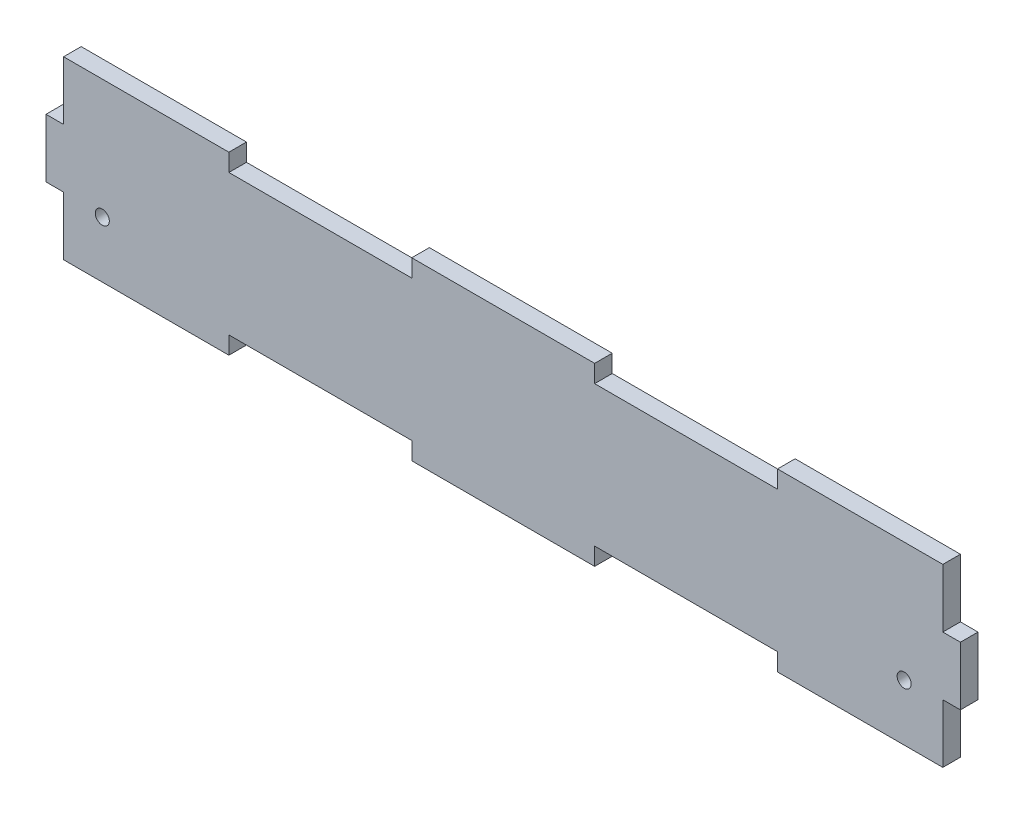
ISO-10303-21;
HEADER;
FILE_DESCRIPTION(('STEP AP214'),'2;1');
FILE_NAME('part.step','',(''),(''),'','','');
FILE_SCHEMA(('AUTOMOTIVE_DESIGN { 1 0 10303 214 1 1 1 1 }'));
ENDSEC;
DATA;
#1=APPLICATION_CONTEXT('core data for automotive mechanical design processes');
#2=APPLICATION_PROTOCOL_DEFINITION('international standard','automotive_design',2000,#1);
#3=PRODUCT_CONTEXT('',#1,'mechanical');
#4=PRODUCT('Part','Part','',(#3));
#5=PRODUCT_RELATED_PRODUCT_CATEGORY('part','',(#4));
#6=PRODUCT_DEFINITION_FORMATION('','',#4);
#7=PRODUCT_DEFINITION_CONTEXT('part definition',#1,'design');
#8=PRODUCT_DEFINITION('design','',#6,#7);
#9=PRODUCT_DEFINITION_SHAPE('','',#8);
#10=(LENGTH_UNIT() NAMED_UNIT(*) SI_UNIT(.MILLI.,.METRE.));
#11=(NAMED_UNIT(*) PLANE_ANGLE_UNIT() SI_UNIT($,.RADIAN.));
#12=(NAMED_UNIT(*) SI_UNIT($,.STERADIAN.) SOLID_ANGLE_UNIT());
#13=UNCERTAINTY_MEASURE_WITH_UNIT(LENGTH_MEASURE(1.E-05),#10,'distance_accuracy_value','');
#14=(GEOMETRIC_REPRESENTATION_CONTEXT(3) GLOBAL_UNCERTAINTY_ASSIGNED_CONTEXT((#13)) GLOBAL_UNIT_ASSIGNED_CONTEXT((#10,
#11,#12)) REPRESENTATION_CONTEXT('',''));
#15=CARTESIAN_POINT('',(0.,0.,0.));
#16=DIRECTION('',(0.,0.,1.));
#17=DIRECTION('',(1.,0.,0.));
#18=AXIS2_PLACEMENT_3D('',#15,#16,#17);
#19=CARTESIAN_POINT('',(0.,0.,5.));
#20=DIRECTION('',(0.,0.,-1.));
#21=DIRECTION('',(-1.,0.,0.));
#22=AXIS2_PLACEMENT_3D('',#19,#20,#21);
#23=PLANE('',#22);
#24=DIRECTION('',(0.,1.,0.));
#25=VECTOR('',#24,1.);
#26=CARTESIAN_POINT('',(52.,0.,5.));
#27=LINE('',#26,#25);
#28=CARTESIAN_POINT('',(52.,0.,5.));
#29=VERTEX_POINT('',#28);
#30=CARTESIAN_POINT('',(52.,5.,5.));
#31=VERTEX_POINT('',#30);
#32=EDGE_CURVE('E304',#29,#31,#27,.T.);
#33=ORIENTED_EDGE('',*,*,#32,.T.);
#34=DIRECTION('',(1.,0.,0.));
#35=VECTOR('',#34,1.);
#36=CARTESIAN_POINT('',(52.,5.,5.));
#37=LINE('',#36,#35);
#38=CARTESIAN_POINT('',(104.,5.,5.));
#39=VERTEX_POINT('',#38);
#40=EDGE_CURVE('E152',#31,#39,#37,.T.);
#41=ORIENTED_EDGE('',*,*,#40,.T.);
#42=DIRECTION('',(0.,-1.,0.));
#43=VECTOR('',#42,1.);
#44=CARTESIAN_POINT('',(104.,5.,5.));
#45=LINE('',#44,#43);
#46=CARTESIAN_POINT('',(104.,0.,5.));
#47=VERTEX_POINT('',#46);
#48=EDGE_CURVE('E379',#39,#47,#45,.T.);
#49=ORIENTED_EDGE('',*,*,#48,.T.);
#50=DIRECTION('',(1.,0.,0.));
#51=VECTOR('',#50,1.);
#52=CARTESIAN_POINT('',(104.,0.,5.));
#53=LINE('',#52,#51);
#54=CARTESIAN_POINT('',(156.,0.,5.));
#55=VERTEX_POINT('',#54);
#56=EDGE_CURVE('E398',#47,#55,#53,.T.);
#57=ORIENTED_EDGE('',*,*,#56,.T.);
#58=DIRECTION('',(0.,1.,0.));
#59=VECTOR('',#58,1.);
#60=CARTESIAN_POINT('',(156.,5.00000000000001,5.));
#61=LINE('',#60,#59);
#62=CARTESIAN_POINT('',(156.,5.00000000000001,5.));
#63=VERTEX_POINT('',#62);
#64=EDGE_CURVE('E395',#55,#63,#61,.T.);
#65=ORIENTED_EDGE('',*,*,#64,.T.);
#66=DIRECTION('',(1.,0.,0.));
#67=VECTOR('',#66,1.);
#68=CARTESIAN_POINT('',(208.,5.00000000000002,5.));
#69=LINE('',#68,#67);
#70=CARTESIAN_POINT('',(208.,5.00000000000002,5.));
#71=VERTEX_POINT('',#70);
#72=EDGE_CURVE('E397',#63,#71,#69,.T.);
#73=ORIENTED_EDGE('',*,*,#72,.T.);
#74=DIRECTION('',(0.,-1.,0.));
#75=VECTOR('',#74,1.);
#76=CARTESIAN_POINT('',(208.,0.,5.));
#77=LINE('',#76,#75);
#78=CARTESIAN_POINT('',(208.,0.,5.));
#79=VERTEX_POINT('',#78);
#80=EDGE_CURVE('E400',#71,#79,#77,.T.);
#81=ORIENTED_EDGE('',*,*,#80,.T.);
#82=DIRECTION('',(1.,0.,0.));
#83=VECTOR('',#82,1.);
#84=CARTESIAN_POINT('',(208.,0.,5.));
#85=LINE('',#84,#83);
#86=CARTESIAN_POINT('',(255.,0.,5.));
#87=VERTEX_POINT('',#86);
#88=EDGE_CURVE('E406',#79,#87,#85,.T.);
#89=ORIENTED_EDGE('',*,*,#88,.T.);
#90=DIRECTION('',(0.,1.,0.));
#91=VECTOR('',#90,1.);
#92=CARTESIAN_POINT('',(255.,16.6666666666667,5.));
#93=LINE('',#92,#91);
#94=CARTESIAN_POINT('',(255.,16.6666666666667,5.));
#95=VERTEX_POINT('',#94);
#96=EDGE_CURVE('E408',#87,#95,#93,.T.);
#97=ORIENTED_EDGE('',*,*,#96,.T.);
#98=DIRECTION('',(1.,0.,0.));
#99=VECTOR('',#98,1.);
#100=CARTESIAN_POINT('',(255.,16.6666666666667,5.));
#101=LINE('',#100,#99);
#102=CARTESIAN_POINT('',(260.,16.6666666666667,5.));
#103=VERTEX_POINT('',#102);
#104=EDGE_CURVE('E410',#95,#103,#101,.T.);
#105=ORIENTED_EDGE('',*,*,#104,.T.);
#106=DIRECTION('',(0.,1.,0.));
#107=VECTOR('',#106,1.);
#108=CARTESIAN_POINT('',(260.,16.6666666666667,5.));
#109=LINE('',#108,#107);
#110=CARTESIAN_POINT('',(260.,33.3333333333333,5.));
#111=VERTEX_POINT('',#110);
#112=EDGE_CURVE('E412',#103,#111,#109,.T.);
#113=ORIENTED_EDGE('',*,*,#112,.T.);
#114=DIRECTION('',(-1.,0.,0.));
#115=VECTOR('',#114,1.);
#116=CARTESIAN_POINT('',(260.,33.3333333333333,5.));
#117=LINE('',#116,#115);
#118=CARTESIAN_POINT('',(255.,33.3333333333333,5.));
#119=VERTEX_POINT('',#118);
#120=EDGE_CURVE('E414',#111,#119,#117,.T.);
#121=ORIENTED_EDGE('',*,*,#120,.T.);
#122=DIRECTION('',(0.,1.,0.));
#123=VECTOR('',#122,1.);
#124=CARTESIAN_POINT('',(255.,33.3333333333333,5.));
#125=LINE('',#124,#123);
#126=CARTESIAN_POINT('',(255.,50.,5.));
#127=VERTEX_POINT('',#126);
#128=EDGE_CURVE('E416',#119,#127,#125,.T.);
#129=ORIENTED_EDGE('',*,*,#128,.T.);
#130=DIRECTION('',(-1.,0.,0.));
#131=VECTOR('',#130,1.);
#132=CARTESIAN_POINT('',(208.,50.,5.));
#133=LINE('',#132,#131);
#134=CARTESIAN_POINT('',(208.,50.,5.));
#135=VERTEX_POINT('',#134);
#136=EDGE_CURVE('E418',#127,#135,#133,.T.);
#137=ORIENTED_EDGE('',*,*,#136,.T.);
#138=DIRECTION('',(0.,-1.,0.));
#139=VECTOR('',#138,1.);
#140=CARTESIAN_POINT('',(208.,50.,5.));
#141=LINE('',#140,#139);
#142=CARTESIAN_POINT('',(208.,45.,5.));
#143=VERTEX_POINT('',#142);
#144=EDGE_CURVE('E420',#135,#143,#141,.T.);
#145=ORIENTED_EDGE('',*,*,#144,.T.);
#146=DIRECTION('',(-1.,0.,0.));
#147=VECTOR('',#146,1.);
#148=CARTESIAN_POINT('',(208.,45.,5.));
#149=LINE('',#148,#147);
#150=CARTESIAN_POINT('',(156.,45.,5.));
#151=VERTEX_POINT('',#150);
#152=EDGE_CURVE('E422',#143,#151,#149,.T.);
#153=ORIENTED_EDGE('',*,*,#152,.T.);
#154=DIRECTION('',(0.,1.,0.));
#155=VECTOR('',#154,1.);
#156=CARTESIAN_POINT('',(156.,45.,5.));
#157=LINE('',#156,#155);
#158=CARTESIAN_POINT('',(156.,50.,5.));
#159=VERTEX_POINT('',#158);
#160=EDGE_CURVE('E424',#151,#159,#157,.T.);
#161=ORIENTED_EDGE('',*,*,#160,.T.);
#162=DIRECTION('',(-1.,0.,0.));
#163=VECTOR('',#162,1.);
#164=CARTESIAN_POINT('',(104.,50.,5.));
#165=LINE('',#164,#163);
#166=CARTESIAN_POINT('',(104.,50.,5.));
#167=VERTEX_POINT('',#166);
#168=EDGE_CURVE('E426',#159,#167,#165,.T.);
#169=ORIENTED_EDGE('',*,*,#168,.T.);
#170=DIRECTION('',(0.,-1.,0.));
#171=VECTOR('',#170,1.);
#172=CARTESIAN_POINT('',(104.,45.,5.));
#173=LINE('',#172,#171);
#174=CARTESIAN_POINT('',(104.,45.,5.));
#175=VERTEX_POINT('',#174);
#176=EDGE_CURVE('E428',#167,#175,#173,.T.);
#177=ORIENTED_EDGE('',*,*,#176,.T.);
#178=DIRECTION('',(-1.,0.,0.));
#179=VECTOR('',#178,1.);
#180=CARTESIAN_POINT('',(52.,45.,5.));
#181=LINE('',#180,#179);
#182=CARTESIAN_POINT('',(52.,45.,5.));
#183=VERTEX_POINT('',#182);
#184=EDGE_CURVE('E430',#175,#183,#181,.T.);
#185=ORIENTED_EDGE('',*,*,#184,.T.);
#186=DIRECTION('',(0.,1.,0.));
#187=VECTOR('',#186,1.);
#188=CARTESIAN_POINT('',(52.,50.,5.));
#189=LINE('',#188,#187);
#190=CARTESIAN_POINT('',(52.,50.,5.));
#191=VERTEX_POINT('',#190);
#192=EDGE_CURVE('E432',#183,#191,#189,.T.);
#193=ORIENTED_EDGE('',*,*,#192,.T.);
#194=DIRECTION('',(-1.,0.,0.));
#195=VECTOR('',#194,1.);
#196=CARTESIAN_POINT('',(5.,50.,5.));
#197=LINE('',#196,#195);
#198=CARTESIAN_POINT('',(5.,50.,5.));
#199=VERTEX_POINT('',#198);
#200=EDGE_CURVE('E434',#191,#199,#197,.T.);
#201=ORIENTED_EDGE('',*,*,#200,.T.);
#202=DIRECTION('',(0.,-1.,0.));
#203=VECTOR('',#202,1.);
#204=CARTESIAN_POINT('',(5.,33.3333333333333,5.));
#205=LINE('',#204,#203);
#206=CARTESIAN_POINT('',(5.,33.3333333333333,5.));
#207=VERTEX_POINT('',#206);
#208=EDGE_CURVE('E436',#199,#207,#205,.T.);
#209=ORIENTED_EDGE('',*,*,#208,.T.);
#210=DIRECTION('',(-1.,0.,0.));
#211=VECTOR('',#210,1.);
#212=CARTESIAN_POINT('',(0.,33.3333333333333,5.));
#213=LINE('',#212,#211);
#214=CARTESIAN_POINT('',(0.,33.3333333333333,5.));
#215=VERTEX_POINT('',#214);
#216=EDGE_CURVE('E438',#207,#215,#213,.T.);
#217=ORIENTED_EDGE('',*,*,#216,.T.);
#218=DIRECTION('',(0.,-1.,0.));
#219=VECTOR('',#218,1.);
#220=CARTESIAN_POINT('',(0.,16.6666666666667,5.));
#221=LINE('',#220,#219);
#222=CARTESIAN_POINT('',(0.,16.6666666666667,5.));
#223=VERTEX_POINT('',#222);
#224=EDGE_CURVE('E231',#215,#223,#221,.T.);
#225=ORIENTED_EDGE('',*,*,#224,.T.);
#226=DIRECTION('',(1.,0.,0.));
#227=VECTOR('',#226,1.);
#228=CARTESIAN_POINT('',(5.,16.6666666666667,5.));
#229=LINE('',#228,#227);
#230=CARTESIAN_POINT('',(5.,16.6666666666667,5.));
#231=VERTEX_POINT('',#230);
#232=EDGE_CURVE('E225',#223,#231,#229,.T.);
#233=ORIENTED_EDGE('',*,*,#232,.T.);
#234=DIRECTION('',(0.,-1.,0.));
#235=VECTOR('',#234,1.);
#236=CARTESIAN_POINT('',(5.,16.6666666666667,5.));
#237=LINE('',#236,#235);
#238=CARTESIAN_POINT('',(5.,0.,5.));
#239=VERTEX_POINT('',#238);
#240=EDGE_CURVE('E229',#231,#239,#237,.T.);
#241=ORIENTED_EDGE('',*,*,#240,.T.);
#242=DIRECTION('',(1.,0.,0.));
#243=VECTOR('',#242,1.);
#244=CARTESIAN_POINT('',(5.,0.,5.));
#245=LINE('',#244,#243);
#246=EDGE_CURVE('E49',#239,#29,#245,.T.);
#247=ORIENTED_EDGE('',*,*,#246,.T.);
#248=EDGE_LOOP('',(#33,#41,#49,#57,#65,#73,#81,#89,#97,#105,#113,#121,#129,#137,#145,#153,#161,
#169,#177,#185,#193,#201,#209,#217,#225,#233,#241,#247));
#249=FACE_BOUND('',#248,.T.);
#250=CARTESIAN_POINT('',(16.,16.,5.));
#251=DIRECTION('',(0.,0.,1.));
#252=DIRECTION('',(1.,0.,0.));
#253=AXIS2_PLACEMENT_3D('',#250,#251,#252);
#254=CIRCLE('',#253,2.);
#255=CARTESIAN_POINT('',(18.,16.,5.));
#256=VERTEX_POINT('',#255);
#257=EDGE_CURVE('E253',#256,#256,#254,.T.);
#258=ORIENTED_EDGE('',*,*,#257,.F.);
#259=EDGE_LOOP('',(#258));
#260=FACE_BOUND('',#259,.T.);
#261=CARTESIAN_POINT('',(244.,16.,5.));
#262=DIRECTION('',(0.,0.,1.));
#263=DIRECTION('',(-1.,0.,0.));
#264=AXIS2_PLACEMENT_3D('',#261,#262,#263);
#265=CIRCLE('',#264,2.);
#266=CARTESIAN_POINT('',(242.,16.,5.));
#267=VERTEX_POINT('',#266);
#268=EDGE_CURVE('E479',#267,#267,#265,.T.);
#269=ORIENTED_EDGE('',*,*,#268,.F.);
#270=EDGE_LOOP('',(#269));
#271=FACE_BOUND('',#270,.T.);
#272=ADVANCED_FACE('F32',(#249,#260,#271),#23,.F.);
#273=CARTESIAN_POINT('',(0.,0.,0.));
#274=DIRECTION('',(0.,0.,-1.));
#275=DIRECTION('',(-1.,0.,0.));
#276=AXIS2_PLACEMENT_3D('',#273,#274,#275);
#277=PLANE('',#276);
#278=CARTESIAN_POINT('',(16.,16.,0.));
#279=DIRECTION('',(0.,0.,1.));
#280=DIRECTION('',(1.,0.,0.));
#281=AXIS2_PLACEMENT_3D('',#278,#279,#280);
#282=CIRCLE('',#281,2.);
#283=CARTESIAN_POINT('',(18.,16.,0.));
#284=VERTEX_POINT('',#283);
#285=EDGE_CURVE('E484',#284,#284,#282,.T.);
#286=ORIENTED_EDGE('',*,*,#285,.T.);
#287=EDGE_LOOP('',(#286));
#288=FACE_BOUND('',#287,.T.);
#289=DIRECTION('',(0.,1.,0.));
#290=VECTOR('',#289,1.);
#291=CARTESIAN_POINT('',(52.,0.,0.));
#292=LINE('',#291,#290);
#293=CARTESIAN_POINT('',(52.,0.,0.));
#294=VERTEX_POINT('',#293);
#295=CARTESIAN_POINT('',(52.,5.,0.));
#296=VERTEX_POINT('',#295);
#297=EDGE_CURVE('E249',#294,#296,#292,.T.);
#298=ORIENTED_EDGE('',*,*,#297,.F.);
#299=DIRECTION('',(1.,0.,0.));
#300=VECTOR('',#299,1.);
#301=CARTESIAN_POINT('',(5.,0.,0.));
#302=LINE('',#301,#300);
#303=CARTESIAN_POINT('',(5.,0.,0.));
#304=VERTEX_POINT('',#303);
#305=EDGE_CURVE('E144',#304,#294,#302,.T.);
#306=ORIENTED_EDGE('',*,*,#305,.F.);
#307=DIRECTION('',(0.,-1.,0.));
#308=VECTOR('',#307,1.);
#309=CARTESIAN_POINT('',(5.,16.6666666666667,0.));
#310=LINE('',#309,#308);
#311=CARTESIAN_POINT('',(5.,16.6666666666667,0.));
#312=VERTEX_POINT('',#311);
#313=EDGE_CURVE('E138',#312,#304,#310,.T.);
#314=ORIENTED_EDGE('',*,*,#313,.F.);
#315=DIRECTION('',(1.,0.,0.));
#316=VECTOR('',#315,1.);
#317=CARTESIAN_POINT('',(5.,16.6666666666667,0.));
#318=LINE('',#317,#316);
#319=CARTESIAN_POINT('',(0.,16.6666666666667,0.));
#320=VERTEX_POINT('',#319);
#321=EDGE_CURVE('E239',#320,#312,#318,.T.);
#322=ORIENTED_EDGE('',*,*,#321,.F.);
#323=DIRECTION('',(0.,-1.,0.));
#324=VECTOR('',#323,1.);
#325=CARTESIAN_POINT('',(0.,16.6666666666667,0.));
#326=LINE('',#325,#324);
#327=CARTESIAN_POINT('',(0.,33.3333333333333,0.));
#328=VERTEX_POINT('',#327);
#329=EDGE_CURVE('E299',#328,#320,#326,.T.);
#330=ORIENTED_EDGE('',*,*,#329,.F.);
#331=DIRECTION('',(-1.,0.,0.));
#332=VECTOR('',#331,1.);
#333=CARTESIAN_POINT('',(0.,33.3333333333333,0.));
#334=LINE('',#333,#332);
#335=CARTESIAN_POINT('',(5.,33.3333333333333,0.));
#336=VERTEX_POINT('',#335);
#337=EDGE_CURVE('E297',#336,#328,#334,.T.);
#338=ORIENTED_EDGE('',*,*,#337,.F.);
#339=DIRECTION('',(0.,-1.,0.));
#340=VECTOR('',#339,1.);
#341=CARTESIAN_POINT('',(5.,33.3333333333333,0.));
#342=LINE('',#341,#340);
#343=CARTESIAN_POINT('',(5.,50.,0.));
#344=VERTEX_POINT('',#343);
#345=EDGE_CURVE('E295',#344,#336,#342,.T.);
#346=ORIENTED_EDGE('',*,*,#345,.F.);
#347=DIRECTION('',(-1.,0.,0.));
#348=VECTOR('',#347,1.);
#349=CARTESIAN_POINT('',(5.,50.,0.));
#350=LINE('',#349,#348);
#351=CARTESIAN_POINT('',(52.,50.,0.));
#352=VERTEX_POINT('',#351);
#353=EDGE_CURVE('E293',#352,#344,#350,.T.);
#354=ORIENTED_EDGE('',*,*,#353,.F.);
#355=DIRECTION('',(0.,1.,0.));
#356=VECTOR('',#355,1.);
#357=CARTESIAN_POINT('',(52.,50.,0.));
#358=LINE('',#357,#356);
#359=CARTESIAN_POINT('',(52.,45.,0.));
#360=VERTEX_POINT('',#359);
#361=EDGE_CURVE('E291',#360,#352,#358,.T.);
#362=ORIENTED_EDGE('',*,*,#361,.F.);
#363=DIRECTION('',(-1.,0.,0.));
#364=VECTOR('',#363,1.);
#365=CARTESIAN_POINT('',(52.,45.,0.));
#366=LINE('',#365,#364);
#367=CARTESIAN_POINT('',(104.,45.,0.));
#368=VERTEX_POINT('',#367);
#369=EDGE_CURVE('E289',#368,#360,#366,.T.);
#370=ORIENTED_EDGE('',*,*,#369,.F.);
#371=DIRECTION('',(0.,-1.,0.));
#372=VECTOR('',#371,1.);
#373=CARTESIAN_POINT('',(104.,45.,0.));
#374=LINE('',#373,#372);
#375=CARTESIAN_POINT('',(104.,50.,0.));
#376=VERTEX_POINT('',#375);
#377=EDGE_CURVE('E287',#376,#368,#374,.T.);
#378=ORIENTED_EDGE('',*,*,#377,.F.);
#379=DIRECTION('',(-1.,0.,0.));
#380=VECTOR('',#379,1.);
#381=CARTESIAN_POINT('',(104.,50.,0.));
#382=LINE('',#381,#380);
#383=CARTESIAN_POINT('',(156.,50.,0.));
#384=VERTEX_POINT('',#383);
#385=EDGE_CURVE('E285',#384,#376,#382,.T.);
#386=ORIENTED_EDGE('',*,*,#385,.F.);
#387=DIRECTION('',(0.,1.,0.));
#388=VECTOR('',#387,1.);
#389=CARTESIAN_POINT('',(156.,45.,0.));
#390=LINE('',#389,#388);
#391=CARTESIAN_POINT('',(156.,45.,0.));
#392=VERTEX_POINT('',#391);
#393=EDGE_CURVE('E283',#392,#384,#390,.T.);
#394=ORIENTED_EDGE('',*,*,#393,.F.);
#395=DIRECTION('',(-1.,0.,0.));
#396=VECTOR('',#395,1.);
#397=CARTESIAN_POINT('',(208.,45.,0.));
#398=LINE('',#397,#396);
#399=CARTESIAN_POINT('',(208.,45.,0.));
#400=VERTEX_POINT('',#399);
#401=EDGE_CURVE('E281',#400,#392,#398,.T.);
#402=ORIENTED_EDGE('',*,*,#401,.F.);
#403=DIRECTION('',(0.,-1.,0.));
#404=VECTOR('',#403,1.);
#405=CARTESIAN_POINT('',(208.,50.,0.));
#406=LINE('',#405,#404);
#407=CARTESIAN_POINT('',(208.,50.,0.));
#408=VERTEX_POINT('',#407);
#409=EDGE_CURVE('E279',#408,#400,#406,.T.);
#410=ORIENTED_EDGE('',*,*,#409,.F.);
#411=DIRECTION('',(-1.,0.,0.));
#412=VECTOR('',#411,1.);
#413=CARTESIAN_POINT('',(208.,50.,0.));
#414=LINE('',#413,#412);
#415=CARTESIAN_POINT('',(255.,50.,0.));
#416=VERTEX_POINT('',#415);
#417=EDGE_CURVE('E277',#416,#408,#414,.T.);
#418=ORIENTED_EDGE('',*,*,#417,.F.);
#419=DIRECTION('',(0.,1.,0.));
#420=VECTOR('',#419,1.);
#421=CARTESIAN_POINT('',(255.,33.3333333333333,0.));
#422=LINE('',#421,#420);
#423=CARTESIAN_POINT('',(255.,33.3333333333333,0.));
#424=VERTEX_POINT('',#423);
#425=EDGE_CURVE('E275',#424,#416,#422,.T.);
#426=ORIENTED_EDGE('',*,*,#425,.F.);
#427=DIRECTION('',(-1.,0.,0.));
#428=VECTOR('',#427,1.);
#429=CARTESIAN_POINT('',(260.,33.3333333333333,0.));
#430=LINE('',#429,#428);
#431=CARTESIAN_POINT('',(260.,33.3333333333333,0.));
#432=VERTEX_POINT('',#431);
#433=EDGE_CURVE('E273',#432,#424,#430,.T.);
#434=ORIENTED_EDGE('',*,*,#433,.F.);
#435=DIRECTION('',(0.,1.,0.));
#436=VECTOR('',#435,1.);
#437=CARTESIAN_POINT('',(260.,16.6666666666667,0.));
#438=LINE('',#437,#436);
#439=CARTESIAN_POINT('',(260.,16.6666666666667,0.));
#440=VERTEX_POINT('',#439);
#441=EDGE_CURVE('E271',#440,#432,#438,.T.);
#442=ORIENTED_EDGE('',*,*,#441,.F.);
#443=DIRECTION('',(1.,0.,0.));
#444=VECTOR('',#443,1.);
#445=CARTESIAN_POINT('',(255.,16.6666666666667,0.));
#446=LINE('',#445,#444);
#447=CARTESIAN_POINT('',(255.,16.6666666666667,0.));
#448=VERTEX_POINT('',#447);
#449=EDGE_CURVE('E269',#448,#440,#446,.T.);
#450=ORIENTED_EDGE('',*,*,#449,.F.);
#451=DIRECTION('',(0.,1.,0.));
#452=VECTOR('',#451,1.);
#453=CARTESIAN_POINT('',(255.,16.6666666666667,0.));
#454=LINE('',#453,#452);
#455=CARTESIAN_POINT('',(255.,0.,0.));
#456=VERTEX_POINT('',#455);
#457=EDGE_CURVE('E267',#456,#448,#454,.T.);
#458=ORIENTED_EDGE('',*,*,#457,.F.);
#459=DIRECTION('',(1.,0.,0.));
#460=VECTOR('',#459,1.);
#461=CARTESIAN_POINT('',(208.,0.,0.));
#462=LINE('',#461,#460);
#463=CARTESIAN_POINT('',(208.,0.,0.));
#464=VERTEX_POINT('',#463);
#465=EDGE_CURVE('E265',#464,#456,#462,.T.);
#466=ORIENTED_EDGE('',*,*,#465,.F.);
#467=DIRECTION('',(0.,-1.,0.));
#468=VECTOR('',#467,1.);
#469=CARTESIAN_POINT('',(208.,0.,0.));
#470=LINE('',#469,#468);
#471=CARTESIAN_POINT('',(208.,5.00000000000002,0.));
#472=VERTEX_POINT('',#471);
#473=EDGE_CURVE('E263',#472,#464,#470,.T.);
#474=ORIENTED_EDGE('',*,*,#473,.F.);
#475=DIRECTION('',(1.,0.,0.));
#476=VECTOR('',#475,1.);
#477=CARTESIAN_POINT('',(208.,5.00000000000002,0.));
#478=LINE('',#477,#476);
#479=CARTESIAN_POINT('',(156.,5.00000000000001,0.));
#480=VERTEX_POINT('',#479);
#481=EDGE_CURVE('E261',#480,#472,#478,.T.);
#482=ORIENTED_EDGE('',*,*,#481,.F.);
#483=DIRECTION('',(0.,1.,0.));
#484=VECTOR('',#483,1.);
#485=CARTESIAN_POINT('',(156.,5.00000000000001,0.));
#486=LINE('',#485,#484);
#487=CARTESIAN_POINT('',(156.,0.,0.));
#488=VERTEX_POINT('',#487);
#489=EDGE_CURVE('E259',#488,#480,#486,.T.);
#490=ORIENTED_EDGE('',*,*,#489,.F.);
#491=DIRECTION('',(1.,0.,0.));
#492=VECTOR('',#491,1.);
#493=CARTESIAN_POINT('',(104.,0.,0.));
#494=LINE('',#493,#492);
#495=CARTESIAN_POINT('',(104.,0.,0.));
#496=VERTEX_POINT('',#495);
#497=EDGE_CURVE('E257',#496,#488,#494,.T.);
#498=ORIENTED_EDGE('',*,*,#497,.F.);
#499=DIRECTION('',(0.,-1.,0.));
#500=VECTOR('',#499,1.);
#501=CARTESIAN_POINT('',(104.,5.,0.));
#502=LINE('',#501,#500);
#503=CARTESIAN_POINT('',(104.,5.,0.));
#504=VERTEX_POINT('',#503);
#505=EDGE_CURVE('E255',#504,#496,#502,.T.);
#506=ORIENTED_EDGE('',*,*,#505,.F.);
#507=DIRECTION('',(1.,0.,0.));
#508=VECTOR('',#507,1.);
#509=CARTESIAN_POINT('',(52.,5.,0.));
#510=LINE('',#509,#508);
#511=EDGE_CURVE('E252',#296,#504,#510,.T.);
#512=ORIENTED_EDGE('',*,*,#511,.F.);
#513=EDGE_LOOP('',(#298,#306,#314,#322,#330,#338,#346,#354,#362,#370,#378,#386,#394,#402,#410,
#418,#426,#434,#442,#450,#458,#466,#474,#482,#490,#498,#506,#512));
#514=FACE_BOUND('',#513,.T.);
#515=CARTESIAN_POINT('',(244.,16.,0.));
#516=DIRECTION('',(0.,0.,1.));
#517=DIRECTION('',(-1.,0.,0.));
#518=AXIS2_PLACEMENT_3D('',#515,#516,#517);
#519=CIRCLE('',#518,2.);
#520=CARTESIAN_POINT('',(242.,16.,0.));
#521=VERTEX_POINT('',#520);
#522=EDGE_CURVE('E482',#521,#521,#519,.T.);
#523=ORIENTED_EDGE('',*,*,#522,.T.);
#524=EDGE_LOOP('',(#523));
#525=FACE_BOUND('',#524,.T.);
#526=ADVANCED_FACE('F383',(#288,#514,#525),#277,.T.);
#527=CARTESIAN_POINT('',(52.,0.,5.));
#528=DIRECTION('',(-1.,0.,0.));
#529=DIRECTION('',(0.,0.,1.));
#530=AXIS2_PLACEMENT_3D('',#527,#528,#529);
#531=PLANE('',#530);
#532=ORIENTED_EDGE('',*,*,#297,.T.);
#533=DIRECTION('',(0.,0.,-1.));
#534=VECTOR('',#533,1.);
#535=CARTESIAN_POINT('',(52.,5.,5.));
#536=LINE('',#535,#534);
#537=EDGE_CURVE('E11',#31,#296,#536,.T.);
#538=ORIENTED_EDGE('',*,*,#537,.F.);
#539=ORIENTED_EDGE('',*,*,#32,.F.);
#540=DIRECTION('',(0.,0.,-1.));
#541=VECTOR('',#540,1.);
#542=CARTESIAN_POINT('',(52.,0.,5.));
#543=LINE('',#542,#541);
#544=EDGE_CURVE('E245',#29,#294,#543,.T.);
#545=ORIENTED_EDGE('',*,*,#544,.T.);
#546=EDGE_LOOP('',(#532,#538,#539,#545));
#547=FACE_BOUND('',#546,.T.);
#548=ADVANCED_FACE('F34',(#547),#531,.F.);
#549=CARTESIAN_POINT('',(52.,5.,5.));
#550=DIRECTION('',(0.,1.,0.));
#551=DIRECTION('',(-1.,0.,0.));
#552=AXIS2_PLACEMENT_3D('',#549,#550,#551);
#553=PLANE('',#552);
#554=ORIENTED_EDGE('',*,*,#511,.T.);
#555=DIRECTION('',(0.,0.,-1.));
#556=VECTOR('',#555,1.);
#557=CARTESIAN_POINT('',(104.,5.,5.));
#558=LINE('',#557,#556);
#559=EDGE_CURVE('E41',#39,#504,#558,.T.);
#560=ORIENTED_EDGE('',*,*,#559,.F.);
#561=ORIENTED_EDGE('',*,*,#40,.F.);
#562=ORIENTED_EDGE('',*,*,#537,.T.);
#563=EDGE_LOOP('',(#554,#560,#561,#562));
#564=FACE_BOUND('',#563,.T.);
#565=ADVANCED_FACE('F739',(#564),#553,.F.);
#566=CARTESIAN_POINT('',(104.,5.,5.));
#567=DIRECTION('',(1.,0.,0.));
#568=DIRECTION('',(0.,0.,-1.));
#569=AXIS2_PLACEMENT_3D('',#566,#567,#568);
#570=PLANE('',#569);
#571=ORIENTED_EDGE('',*,*,#505,.T.);
#572=DIRECTION('',(0.,0.,-1.));
#573=VECTOR('',#572,1.);
#574=CARTESIAN_POINT('',(104.,0.,5.));
#575=LINE('',#574,#573);
#576=EDGE_CURVE('E371',#47,#496,#575,.T.);
#577=ORIENTED_EDGE('',*,*,#576,.F.);
#578=ORIENTED_EDGE('',*,*,#48,.F.);
#579=ORIENTED_EDGE('',*,*,#559,.T.);
#580=EDGE_LOOP('',(#571,#577,#578,#579));
#581=FACE_BOUND('',#580,.T.);
#582=ADVANCED_FACE('F377',(#581),#570,.F.);
#583=CARTESIAN_POINT('',(104.,0.,5.));
#584=DIRECTION('',(0.,1.,0.));
#585=DIRECTION('',(-1.,0.,0.));
#586=AXIS2_PLACEMENT_3D('',#583,#584,#585);
#587=PLANE('',#586);
#588=ORIENTED_EDGE('',*,*,#497,.T.);
#589=DIRECTION('',(0.,0.,-1.));
#590=VECTOR('',#589,1.);
#591=CARTESIAN_POINT('',(156.,0.,5.));
#592=LINE('',#591,#590);
#593=EDGE_CURVE('E368',#55,#488,#592,.T.);
#594=ORIENTED_EDGE('',*,*,#593,.F.);
#595=ORIENTED_EDGE('',*,*,#56,.F.);
#596=ORIENTED_EDGE('',*,*,#576,.T.);
#597=EDGE_LOOP('',(#588,#594,#595,#596));
#598=FACE_BOUND('',#597,.T.);
#599=ADVANCED_FACE('F389',(#598),#587,.F.);
#600=CARTESIAN_POINT('',(156.,5.00000000000001,5.));
#601=DIRECTION('',(-1.,0.,0.));
#602=DIRECTION('',(0.,0.,1.));
#603=AXIS2_PLACEMENT_3D('',#600,#601,#602);
#604=PLANE('',#603);
#605=ORIENTED_EDGE('',*,*,#489,.T.);
#606=DIRECTION('',(0.,0.,-1.));
#607=VECTOR('',#606,1.);
#608=CARTESIAN_POINT('',(156.,5.00000000000001,5.));
#609=LINE('',#608,#607);
#610=EDGE_CURVE('E365',#63,#480,#609,.T.);
#611=ORIENTED_EDGE('',*,*,#610,.F.);
#612=ORIENTED_EDGE('',*,*,#64,.F.);
#613=ORIENTED_EDGE('',*,*,#593,.T.);
#614=EDGE_LOOP('',(#605,#611,#612,#613));
#615=FACE_BOUND('',#614,.T.);
#616=ADVANCED_FACE('F393',(#615),#604,.F.);
#617=CARTESIAN_POINT('',(208.,5.00000000000002,5.));
#618=DIRECTION('',(0.,1.,0.));
#619=DIRECTION('',(-1.,0.,0.));
#620=AXIS2_PLACEMENT_3D('',#617,#618,#619);
#621=PLANE('',#620);
#622=ORIENTED_EDGE('',*,*,#481,.T.);
#623=DIRECTION('',(0.,0.,-1.));
#624=VECTOR('',#623,1.);
#625=CARTESIAN_POINT('',(208.,5.00000000000002,5.));
#626=LINE('',#625,#624);
#627=EDGE_CURVE('E362',#71,#472,#626,.T.);
#628=ORIENTED_EDGE('',*,*,#627,.F.);
#629=ORIENTED_EDGE('',*,*,#72,.F.);
#630=ORIENTED_EDGE('',*,*,#610,.T.);
#631=EDGE_LOOP('',(#622,#628,#629,#630));
#632=FACE_BOUND('',#631,.T.);
#633=ADVANCED_FACE('F704',(#632),#621,.F.);
#634=CARTESIAN_POINT('',(208.,0.,5.));
#635=DIRECTION('',(1.,0.,0.));
#636=DIRECTION('',(0.,0.,-1.));
#637=AXIS2_PLACEMENT_3D('',#634,#635,#636);
#638=PLANE('',#637);
#639=ORIENTED_EDGE('',*,*,#473,.T.);
#640=DIRECTION('',(0.,0.,-1.));
#641=VECTOR('',#640,1.);
#642=CARTESIAN_POINT('',(208.,0.,5.));
#643=LINE('',#642,#641);
#644=EDGE_CURVE('E359',#79,#464,#643,.T.);
#645=ORIENTED_EDGE('',*,*,#644,.F.);
#646=ORIENTED_EDGE('',*,*,#80,.F.);
#647=ORIENTED_EDGE('',*,*,#627,.T.);
#648=EDGE_LOOP('',(#639,#645,#646,#647));
#649=FACE_BOUND('',#648,.T.);
#650=ADVANCED_FACE('F694',(#649),#638,.F.);
#651=CARTESIAN_POINT('',(208.,0.,5.));
#652=DIRECTION('',(0.,1.,0.));
#653=DIRECTION('',(-1.,0.,0.));
#654=AXIS2_PLACEMENT_3D('',#651,#652,#653);
#655=PLANE('',#654);
#656=ORIENTED_EDGE('',*,*,#465,.T.);
#657=DIRECTION('',(0.,0.,-1.));
#658=VECTOR('',#657,1.);
#659=CARTESIAN_POINT('',(255.,0.,5.));
#660=LINE('',#659,#658);
#661=EDGE_CURVE('E356',#87,#456,#660,.T.);
#662=ORIENTED_EDGE('',*,*,#661,.F.);
#663=ORIENTED_EDGE('',*,*,#88,.F.);
#664=ORIENTED_EDGE('',*,*,#644,.T.);
#665=EDGE_LOOP('',(#656,#662,#663,#664));
#666=FACE_BOUND('',#665,.T.);
#667=ADVANCED_FACE('F684',(#666),#655,.F.);
#668=CARTESIAN_POINT('',(255.,16.6666666666667,5.));
#669=DIRECTION('',(-1.,0.,0.));
#670=DIRECTION('',(0.,0.,1.));
#671=AXIS2_PLACEMENT_3D('',#668,#669,#670);
#672=PLANE('',#671);
#673=ORIENTED_EDGE('',*,*,#457,.T.);
#674=DIRECTION('',(0.,0.,-1.));
#675=VECTOR('',#674,1.);
#676=CARTESIAN_POINT('',(255.,16.6666666666667,5.));
#677=LINE('',#676,#675);
#678=EDGE_CURVE('E353',#95,#448,#677,.T.);
#679=ORIENTED_EDGE('',*,*,#678,.F.);
#680=ORIENTED_EDGE('',*,*,#96,.F.);
#681=ORIENTED_EDGE('',*,*,#661,.T.);
#682=EDGE_LOOP('',(#673,#679,#680,#681));
#683=FACE_BOUND('',#682,.T.);
#684=ADVANCED_FACE('F674',(#683),#672,.F.);
#685=CARTESIAN_POINT('',(255.,16.6666666666667,5.));
#686=DIRECTION('',(0.,1.,0.));
#687=DIRECTION('',(0.,0.,1.));
#688=AXIS2_PLACEMENT_3D('',#685,#686,#687);
#689=PLANE('',#688);
#690=ORIENTED_EDGE('',*,*,#449,.T.);
#691=DIRECTION('',(0.,0.,-1.));
#692=VECTOR('',#691,1.);
#693=CARTESIAN_POINT('',(260.,16.6666666666667,5.));
#694=LINE('',#693,#692);
#695=EDGE_CURVE('E350',#103,#440,#694,.T.);
#696=ORIENTED_EDGE('',*,*,#695,.F.);
#697=ORIENTED_EDGE('',*,*,#104,.F.);
#698=ORIENTED_EDGE('',*,*,#678,.T.);
#699=EDGE_LOOP('',(#690,#696,#697,#698));
#700=FACE_BOUND('',#699,.T.);
#701=ADVANCED_FACE('F664',(#700),#689,.F.);
#702=CARTESIAN_POINT('',(260.,16.6666666666667,5.));
#703=DIRECTION('',(-1.,0.,0.));
#704=DIRECTION('',(0.,0.,1.));
#705=AXIS2_PLACEMENT_3D('',#702,#703,#704);
#706=PLANE('',#705);
#707=ORIENTED_EDGE('',*,*,#441,.T.);
#708=DIRECTION('',(0.,0.,-1.));
#709=VECTOR('',#708,1.);
#710=CARTESIAN_POINT('',(260.,33.3333333333333,5.));
#711=LINE('',#710,#709);
#712=EDGE_CURVE('E347',#111,#432,#711,.T.);
#713=ORIENTED_EDGE('',*,*,#712,.F.);
#714=ORIENTED_EDGE('',*,*,#112,.F.);
#715=ORIENTED_EDGE('',*,*,#695,.T.);
#716=EDGE_LOOP('',(#707,#713,#714,#715));
#717=FACE_BOUND('',#716,.T.);
#718=ADVANCED_FACE('F654',(#717),#706,.F.);
#719=CARTESIAN_POINT('',(260.,33.3333333333333,5.));
#720=DIRECTION('',(0.,-1.,0.));
#721=DIRECTION('',(0.,0.,-1.));
#722=AXIS2_PLACEMENT_3D('',#719,#720,#721);
#723=PLANE('',#722);
#724=ORIENTED_EDGE('',*,*,#433,.T.);
#725=DIRECTION('',(0.,0.,-1.));
#726=VECTOR('',#725,1.);
#727=CARTESIAN_POINT('',(255.,33.3333333333333,5.));
#728=LINE('',#727,#726);
#729=EDGE_CURVE('E344',#119,#424,#728,.T.);
#730=ORIENTED_EDGE('',*,*,#729,.F.);
#731=ORIENTED_EDGE('',*,*,#120,.F.);
#732=ORIENTED_EDGE('',*,*,#712,.T.);
#733=EDGE_LOOP('',(#724,#730,#731,#732));
#734=FACE_BOUND('',#733,.T.);
#735=ADVANCED_FACE('F644',(#734),#723,.F.);
#736=CARTESIAN_POINT('',(255.,33.3333333333333,5.));
#737=DIRECTION('',(-1.,0.,0.));
#738=DIRECTION('',(0.,0.,1.));
#739=AXIS2_PLACEMENT_3D('',#736,#737,#738);
#740=PLANE('',#739);
#741=ORIENTED_EDGE('',*,*,#425,.T.);
#742=DIRECTION('',(0.,0.,-1.));
#743=VECTOR('',#742,1.);
#744=CARTESIAN_POINT('',(255.,50.,5.));
#745=LINE('',#744,#743);
#746=EDGE_CURVE('E341',#127,#416,#745,.T.);
#747=ORIENTED_EDGE('',*,*,#746,.F.);
#748=ORIENTED_EDGE('',*,*,#128,.F.);
#749=ORIENTED_EDGE('',*,*,#729,.T.);
#750=EDGE_LOOP('',(#741,#747,#748,#749));
#751=FACE_BOUND('',#750,.T.);
#752=ADVANCED_FACE('F634',(#751),#740,.F.);
#753=CARTESIAN_POINT('',(208.,50.,5.));
#754=DIRECTION('',(0.,-1.,0.));
#755=DIRECTION('',(1.,0.,0.));
#756=AXIS2_PLACEMENT_3D('',#753,#754,#755);
#757=PLANE('',#756);
#758=ORIENTED_EDGE('',*,*,#417,.T.);
#759=DIRECTION('',(0.,0.,-1.));
#760=VECTOR('',#759,1.);
#761=CARTESIAN_POINT('',(208.,50.,5.));
#762=LINE('',#761,#760);
#763=EDGE_CURVE('E338',#135,#408,#762,.T.);
#764=ORIENTED_EDGE('',*,*,#763,.F.);
#765=ORIENTED_EDGE('',*,*,#136,.F.);
#766=ORIENTED_EDGE('',*,*,#746,.T.);
#767=EDGE_LOOP('',(#758,#764,#765,#766));
#768=FACE_BOUND('',#767,.T.);
#769=ADVANCED_FACE('F624',(#768),#757,.F.);
#770=CARTESIAN_POINT('',(208.,50.,5.));
#771=DIRECTION('',(1.,0.,0.));
#772=DIRECTION('',(0.,0.,-1.));
#773=AXIS2_PLACEMENT_3D('',#770,#771,#772);
#774=PLANE('',#773);
#775=ORIENTED_EDGE('',*,*,#409,.T.);
#776=DIRECTION('',(0.,0.,-1.));
#777=VECTOR('',#776,1.);
#778=CARTESIAN_POINT('',(208.,45.,5.));
#779=LINE('',#778,#777);
#780=EDGE_CURVE('E335',#143,#400,#779,.T.);
#781=ORIENTED_EDGE('',*,*,#780,.F.);
#782=ORIENTED_EDGE('',*,*,#144,.F.);
#783=ORIENTED_EDGE('',*,*,#763,.T.);
#784=EDGE_LOOP('',(#775,#781,#782,#783));
#785=FACE_BOUND('',#784,.T.);
#786=ADVANCED_FACE('F614',(#785),#774,.F.);
#787=CARTESIAN_POINT('',(208.,45.,5.));
#788=DIRECTION('',(0.,-1.,0.));
#789=DIRECTION('',(1.,0.,0.));
#790=AXIS2_PLACEMENT_3D('',#787,#788,#789);
#791=PLANE('',#790);
#792=ORIENTED_EDGE('',*,*,#401,.T.);
#793=DIRECTION('',(0.,0.,-1.));
#794=VECTOR('',#793,1.);
#795=CARTESIAN_POINT('',(156.,45.,5.));
#796=LINE('',#795,#794);
#797=EDGE_CURVE('E332',#151,#392,#796,.T.);
#798=ORIENTED_EDGE('',*,*,#797,.F.);
#799=ORIENTED_EDGE('',*,*,#152,.F.);
#800=ORIENTED_EDGE('',*,*,#780,.T.);
#801=EDGE_LOOP('',(#792,#798,#799,#800));
#802=FACE_BOUND('',#801,.T.);
#803=ADVANCED_FACE('F604',(#802),#791,.F.);
#804=CARTESIAN_POINT('',(156.,45.,5.));
#805=DIRECTION('',(-1.,0.,0.));
#806=DIRECTION('',(0.,0.,1.));
#807=AXIS2_PLACEMENT_3D('',#804,#805,#806);
#808=PLANE('',#807);
#809=ORIENTED_EDGE('',*,*,#393,.T.);
#810=DIRECTION('',(0.,0.,-1.));
#811=VECTOR('',#810,1.);
#812=CARTESIAN_POINT('',(156.,50.,5.));
#813=LINE('',#812,#811);
#814=EDGE_CURVE('E329',#159,#384,#813,.T.);
#815=ORIENTED_EDGE('',*,*,#814,.F.);
#816=ORIENTED_EDGE('',*,*,#160,.F.);
#817=ORIENTED_EDGE('',*,*,#797,.T.);
#818=EDGE_LOOP('',(#809,#815,#816,#817));
#819=FACE_BOUND('',#818,.T.);
#820=ADVANCED_FACE('F594',(#819),#808,.F.);
#821=CARTESIAN_POINT('',(104.,50.,5.));
#822=DIRECTION('',(0.,-1.,0.));
#823=DIRECTION('',(1.,0.,0.));
#824=AXIS2_PLACEMENT_3D('',#821,#822,#823);
#825=PLANE('',#824);
#826=ORIENTED_EDGE('',*,*,#385,.T.);
#827=DIRECTION('',(0.,0.,-1.));
#828=VECTOR('',#827,1.);
#829=CARTESIAN_POINT('',(104.,50.,5.));
#830=LINE('',#829,#828);
#831=EDGE_CURVE('E326',#167,#376,#830,.T.);
#832=ORIENTED_EDGE('',*,*,#831,.F.);
#833=ORIENTED_EDGE('',*,*,#168,.F.);
#834=ORIENTED_EDGE('',*,*,#814,.T.);
#835=EDGE_LOOP('',(#826,#832,#833,#834));
#836=FACE_BOUND('',#835,.T.);
#837=ADVANCED_FACE('F584',(#836),#825,.F.);
#838=CARTESIAN_POINT('',(104.,45.,5.));
#839=DIRECTION('',(1.,0.,0.));
#840=DIRECTION('',(0.,0.,-1.));
#841=AXIS2_PLACEMENT_3D('',#838,#839,#840);
#842=PLANE('',#841);
#843=ORIENTED_EDGE('',*,*,#377,.T.);
#844=DIRECTION('',(0.,0.,-1.));
#845=VECTOR('',#844,1.);
#846=CARTESIAN_POINT('',(104.,45.,5.));
#847=LINE('',#846,#845);
#848=EDGE_CURVE('E323',#175,#368,#847,.T.);
#849=ORIENTED_EDGE('',*,*,#848,.F.);
#850=ORIENTED_EDGE('',*,*,#176,.F.);
#851=ORIENTED_EDGE('',*,*,#831,.T.);
#852=EDGE_LOOP('',(#843,#849,#850,#851));
#853=FACE_BOUND('',#852,.T.);
#854=ADVANCED_FACE('F574',(#853),#842,.F.);
#855=CARTESIAN_POINT('',(52.,45.,5.));
#856=DIRECTION('',(0.,-1.,0.));
#857=DIRECTION('',(1.,0.,0.));
#858=AXIS2_PLACEMENT_3D('',#855,#856,#857);
#859=PLANE('',#858);
#860=ORIENTED_EDGE('',*,*,#369,.T.);
#861=DIRECTION('',(0.,0.,-1.));
#862=VECTOR('',#861,1.);
#863=CARTESIAN_POINT('',(52.,45.,5.));
#864=LINE('',#863,#862);
#865=EDGE_CURVE('E320',#183,#360,#864,.T.);
#866=ORIENTED_EDGE('',*,*,#865,.F.);
#867=ORIENTED_EDGE('',*,*,#184,.F.);
#868=ORIENTED_EDGE('',*,*,#848,.T.);
#869=EDGE_LOOP('',(#860,#866,#867,#868));
#870=FACE_BOUND('',#869,.T.);
#871=ADVANCED_FACE('F564',(#870),#859,.F.);
#872=CARTESIAN_POINT('',(52.,50.,5.));
#873=DIRECTION('',(-1.,0.,0.));
#874=DIRECTION('',(0.,0.,1.));
#875=AXIS2_PLACEMENT_3D('',#872,#873,#874);
#876=PLANE('',#875);
#877=ORIENTED_EDGE('',*,*,#361,.T.);
#878=DIRECTION('',(0.,0.,-1.));
#879=VECTOR('',#878,1.);
#880=CARTESIAN_POINT('',(52.,50.,5.));
#881=LINE('',#880,#879);
#882=EDGE_CURVE('E317',#191,#352,#881,.T.);
#883=ORIENTED_EDGE('',*,*,#882,.F.);
#884=ORIENTED_EDGE('',*,*,#192,.F.);
#885=ORIENTED_EDGE('',*,*,#865,.T.);
#886=EDGE_LOOP('',(#877,#883,#884,#885));
#887=FACE_BOUND('',#886,.T.);
#888=ADVANCED_FACE('F554',(#887),#876,.F.);
#889=CARTESIAN_POINT('',(5.,50.,5.));
#890=DIRECTION('',(0.,-1.,0.));
#891=DIRECTION('',(1.,0.,0.));
#892=AXIS2_PLACEMENT_3D('',#889,#890,#891);
#893=PLANE('',#892);
#894=ORIENTED_EDGE('',*,*,#353,.T.);
#895=DIRECTION('',(0.,0.,-1.));
#896=VECTOR('',#895,1.);
#897=CARTESIAN_POINT('',(5.,50.,5.));
#898=LINE('',#897,#896);
#899=EDGE_CURVE('E314',#199,#344,#898,.T.);
#900=ORIENTED_EDGE('',*,*,#899,.F.);
#901=ORIENTED_EDGE('',*,*,#200,.F.);
#902=ORIENTED_EDGE('',*,*,#882,.T.);
#903=EDGE_LOOP('',(#894,#900,#901,#902));
#904=FACE_BOUND('',#903,.T.);
#905=ADVANCED_FACE('F544',(#904),#893,.F.);
#906=CARTESIAN_POINT('',(5.,33.3333333333333,5.));
#907=DIRECTION('',(1.,0.,0.));
#908=DIRECTION('',(0.,0.,-1.));
#909=AXIS2_PLACEMENT_3D('',#906,#907,#908);
#910=PLANE('',#909);
#911=ORIENTED_EDGE('',*,*,#345,.T.);
#912=DIRECTION('',(0.,0.,-1.));
#913=VECTOR('',#912,1.);
#914=CARTESIAN_POINT('',(5.,33.3333333333333,5.));
#915=LINE('',#914,#913);
#916=EDGE_CURVE('E311',#207,#336,#915,.T.);
#917=ORIENTED_EDGE('',*,*,#916,.F.);
#918=ORIENTED_EDGE('',*,*,#208,.F.);
#919=ORIENTED_EDGE('',*,*,#899,.T.);
#920=EDGE_LOOP('',(#911,#917,#918,#919));
#921=FACE_BOUND('',#920,.T.);
#922=ADVANCED_FACE('F535',(#921),#910,.F.);
#923=CARTESIAN_POINT('',(0.,33.3333333333333,5.));
#924=DIRECTION('',(0.,-1.,0.));
#925=DIRECTION('',(0.,0.,-1.));
#926=AXIS2_PLACEMENT_3D('',#923,#924,#925);
#927=PLANE('',#926);
#928=ORIENTED_EDGE('',*,*,#337,.T.);
#929=DIRECTION('',(0.,0.,-1.));
#930=VECTOR('',#929,1.);
#931=CARTESIAN_POINT('',(0.,33.3333333333333,5.));
#932=LINE('',#931,#930);
#933=EDGE_CURVE('E308',#215,#328,#932,.T.);
#934=ORIENTED_EDGE('',*,*,#933,.F.);
#935=ORIENTED_EDGE('',*,*,#216,.F.);
#936=ORIENTED_EDGE('',*,*,#916,.T.);
#937=EDGE_LOOP('',(#928,#934,#935,#936));
#938=FACE_BOUND('',#937,.T.);
#939=ADVANCED_FACE('F444',(#938),#927,.F.);
#940=CARTESIAN_POINT('',(0.,16.6666666666667,5.));
#941=DIRECTION('',(1.,0.,0.));
#942=DIRECTION('',(0.,1.,0.));
#943=AXIS2_PLACEMENT_3D('',#940,#941,#942);
#944=PLANE('',#943);
#945=ORIENTED_EDGE('',*,*,#329,.T.);
#946=DIRECTION('',(0.,0.,-1.));
#947=VECTOR('',#946,1.);
#948=CARTESIAN_POINT('',(0.,16.6666666666667,5.));
#949=LINE('',#948,#947);
#950=EDGE_CURVE('E240',#223,#320,#949,.T.);
#951=ORIENTED_EDGE('',*,*,#950,.F.);
#952=ORIENTED_EDGE('',*,*,#224,.F.);
#953=ORIENTED_EDGE('',*,*,#933,.T.);
#954=EDGE_LOOP('',(#945,#951,#952,#953));
#955=FACE_BOUND('',#954,.T.);
#956=ADVANCED_FACE('F448',(#955),#944,.F.);
#957=CARTESIAN_POINT('',(5.,16.6666666666667,5.));
#958=DIRECTION('',(0.,1.,0.));
#959=DIRECTION('',(0.,0.,1.));
#960=AXIS2_PLACEMENT_3D('',#957,#958,#959);
#961=PLANE('',#960);
#962=ORIENTED_EDGE('',*,*,#321,.T.);
#963=DIRECTION('',(0.,0.,-1.));
#964=VECTOR('',#963,1.);
#965=CARTESIAN_POINT('',(5.,16.6666666666667,5.));
#966=LINE('',#965,#964);
#967=EDGE_CURVE('E236',#231,#312,#966,.T.);
#968=ORIENTED_EDGE('',*,*,#967,.F.);
#969=ORIENTED_EDGE('',*,*,#232,.F.);
#970=ORIENTED_EDGE('',*,*,#950,.T.);
#971=EDGE_LOOP('',(#962,#968,#969,#970));
#972=FACE_BOUND('',#971,.T.);
#973=ADVANCED_FACE('F237',(#972),#961,.F.);
#974=CARTESIAN_POINT('',(5.,16.6666666666667,5.));
#975=DIRECTION('',(1.,0.,0.));
#976=DIRECTION('',(0.,0.,-1.));
#977=AXIS2_PLACEMENT_3D('',#974,#975,#976);
#978=PLANE('',#977);
#979=ORIENTED_EDGE('',*,*,#313,.T.);
#980=DIRECTION('',(0.,0.,-1.));
#981=VECTOR('',#980,1.);
#982=CARTESIAN_POINT('',(5.,0.,5.));
#983=LINE('',#982,#981);
#984=EDGE_CURVE('E241',#239,#304,#983,.T.);
#985=ORIENTED_EDGE('',*,*,#984,.F.);
#986=ORIENTED_EDGE('',*,*,#240,.F.);
#987=ORIENTED_EDGE('',*,*,#967,.T.);
#988=EDGE_LOOP('',(#979,#985,#986,#987));
#989=FACE_BOUND('',#988,.T.);
#990=ADVANCED_FACE('F243',(#989),#978,.F.);
#991=CARTESIAN_POINT('',(5.,0.,5.));
#992=DIRECTION('',(0.,1.,0.));
#993=DIRECTION('',(0.,0.,1.));
#994=AXIS2_PLACEMENT_3D('',#991,#992,#993);
#995=PLANE('',#994);
#996=ORIENTED_EDGE('',*,*,#305,.T.);
#997=ORIENTED_EDGE('',*,*,#544,.F.);
#998=ORIENTED_EDGE('',*,*,#246,.F.);
#999=ORIENTED_EDGE('',*,*,#984,.T.);
#1000=EDGE_LOOP('',(#996,#997,#998,#999));
#1001=FACE_BOUND('',#1000,.T.);
#1002=ADVANCED_FACE('F452',(#1001),#995,.F.);
#1003=CARTESIAN_POINT('',(16.,16.,5.));
#1004=DIRECTION('',(0.,0.,-1.));
#1005=DIRECTION('',(-1.,0.,0.));
#1006=AXIS2_PLACEMENT_3D('',#1003,#1004,#1005);
#1007=CYLINDRICAL_SURFACE('',#1006,2.);
#1008=ORIENTED_EDGE('',*,*,#257,.T.);
#1009=EDGE_LOOP('',(#1008));
#1010=FACE_BOUND('',#1009,.T.);
#1011=ORIENTED_EDGE('',*,*,#285,.F.);
#1012=EDGE_LOOP('',(#1011));
#1013=FACE_BOUND('',#1012,.T.);
#1014=ADVANCED_FACE('F454',(#1010,#1013),#1007,.F.);
#1015=CARTESIAN_POINT('',(244.,16.,5.));
#1016=DIRECTION('',(0.,0.,-1.));
#1017=DIRECTION('',(-1.,0.,0.));
#1018=AXIS2_PLACEMENT_3D('',#1015,#1016,#1017);
#1019=CYLINDRICAL_SURFACE('',#1018,2.);
#1020=ORIENTED_EDGE('',*,*,#268,.T.);
#1021=EDGE_LOOP('',(#1020));
#1022=FACE_BOUND('',#1021,.T.);
#1023=ORIENTED_EDGE('',*,*,#522,.F.);
#1024=EDGE_LOOP('',(#1023));
#1025=FACE_BOUND('',#1024,.T.);
#1026=ADVANCED_FACE('F460',(#1022,#1025),#1019,.F.);
#1027=CLOSED_SHELL('',(#272,#526,#548,#565,#582,#599,#616,#633,#650,#667,#684,#701,#718,#735,
#752,#769,#786,#803,#820,#837,#854,#871,#888,#905,#922,#939,#956,#973,#990,#1002,#1014,#1026));
#1028=MANIFOLD_SOLID_BREP('B2',#1027);
#1029=ADVANCED_BREP_SHAPE_REPRESENTATION('',(#18,#1028),#14);
#1030=SHAPE_DEFINITION_REPRESENTATION(#9,#1029);
ENDSEC;
END-ISO-10303-21;
